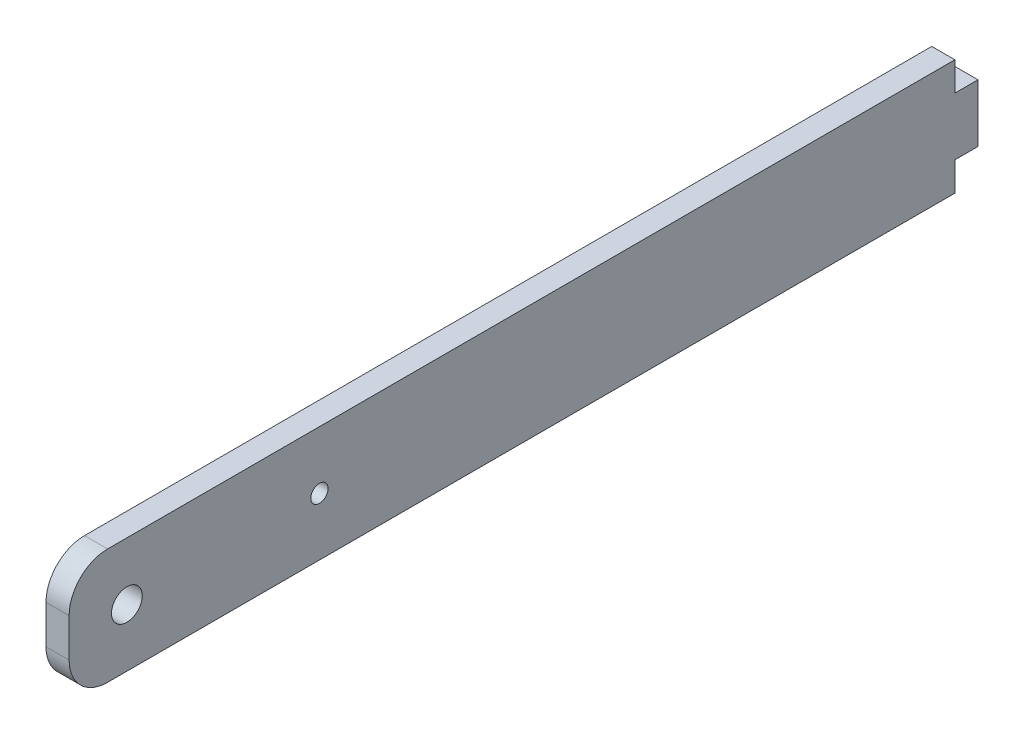
ISO-10303-21;
HEADER;
FILE_DESCRIPTION(('STEP AP214'),'2;1');
FILE_NAME('part.step','',(''),(''),'','','');
FILE_SCHEMA(('AUTOMOTIVE_DESIGN { 1 0 10303 214 1 1 1 1 }'));
ENDSEC;
DATA;
#1=APPLICATION_CONTEXT('core data for automotive mechanical design processes');
#2=APPLICATION_PROTOCOL_DEFINITION('international standard','automotive_design',2000,#1);
#3=PRODUCT_CONTEXT('',#1,'mechanical');
#4=PRODUCT('Part','Part','',(#3));
#5=PRODUCT_RELATED_PRODUCT_CATEGORY('part','',(#4));
#6=PRODUCT_DEFINITION_FORMATION('','',#4);
#7=PRODUCT_DEFINITION_CONTEXT('part definition',#1,'design');
#8=PRODUCT_DEFINITION('design','',#6,#7);
#9=PRODUCT_DEFINITION_SHAPE('','',#8);
#10=(LENGTH_UNIT() NAMED_UNIT(*) SI_UNIT(.MILLI.,.METRE.));
#11=(NAMED_UNIT(*) PLANE_ANGLE_UNIT() SI_UNIT($,.RADIAN.));
#12=(NAMED_UNIT(*) SI_UNIT($,.STERADIAN.) SOLID_ANGLE_UNIT());
#13=UNCERTAINTY_MEASURE_WITH_UNIT(LENGTH_MEASURE(1.E-05),#10,'distance_accuracy_value','');
#14=(GEOMETRIC_REPRESENTATION_CONTEXT(3) GLOBAL_UNCERTAINTY_ASSIGNED_CONTEXT((#13)) GLOBAL_UNIT_ASSIGNED_CONTEXT((#10,
#11,#12)) REPRESENTATION_CONTEXT('',''));
#15=CARTESIAN_POINT('',(0.,0.,0.));
#16=DIRECTION('',(0.,0.,1.));
#17=DIRECTION('',(1.,0.,0.));
#18=AXIS2_PLACEMENT_3D('',#15,#16,#17);
#19=CARTESIAN_POINT('',(3.,0.,0.));
#20=DIRECTION('',(-1.,0.,0.));
#21=DIRECTION('',(0.,0.,1.));
#22=AXIS2_PLACEMENT_3D('',#19,#20,#21);
#23=PLANE('',#22);
#24=DIRECTION('',(0.,-1.,0.));
#25=VECTOR('',#24,1.);
#26=CARTESIAN_POINT('',(3.,15.,115.));
#27=LINE('',#26,#25);
#28=CARTESIAN_POINT('',(3.,5.,115.));
#29=VERTEX_POINT('',#28);
#30=CARTESIAN_POINT('',(3.,-5.,115.));
#31=VERTEX_POINT('',#30);
#32=EDGE_CURVE('E143',#29,#31,#27,.T.);
#33=ORIENTED_EDGE('',*,*,#32,.T.);
#34=CARTESIAN_POINT('',(3.,-5.,105.));
#35=DIRECTION('',(-1.,0.,0.));
#36=DIRECTION('',(0.,0.,1.));
#37=AXIS2_PLACEMENT_3D('',#34,#35,#36);
#38=CIRCLE('',#37,10.);
#39=CARTESIAN_POINT('',(3.,-15.,105.));
#40=VERTEX_POINT('',#39);
#41=EDGE_CURVE('E40',#31,#40,#38,.F.);
#42=ORIENTED_EDGE('',*,*,#41,.T.);
#43=DIRECTION('',(0.,0.,-1.));
#44=VECTOR('',#43,1.);
#45=CARTESIAN_POINT('',(3.,-15.,-115.));
#46=LINE('',#45,#44);
#47=CARTESIAN_POINT('',(3.,-15.,-115.));
#48=VERTEX_POINT('',#47);
#49=EDGE_CURVE('E170',#40,#48,#46,.T.);
#50=ORIENTED_EDGE('',*,*,#49,.T.);
#51=DIRECTION('',(0.,1.,0.));
#52=VECTOR('',#51,1.);
#53=CARTESIAN_POINT('',(3.,15.,-115.));
#54=LINE('',#53,#52);
#55=CARTESIAN_POINT('',(3.,-7.5,-115.));
#56=VERTEX_POINT('',#55);
#57=EDGE_CURVE('E188',#48,#56,#54,.T.);
#58=ORIENTED_EDGE('',*,*,#57,.T.);
#59=DIRECTION('',(0.,0.,-1.));
#60=VECTOR('',#59,1.);
#61=CARTESIAN_POINT('',(3.,-7.5,-115.));
#62=LINE('',#61,#60);
#63=CARTESIAN_POINT('',(3.,-7.5,-121.));
#64=VERTEX_POINT('',#63);
#65=EDGE_CURVE('E116',#56,#64,#62,.T.);
#66=ORIENTED_EDGE('',*,*,#65,.T.);
#67=DIRECTION('',(0.,1.,0.));
#68=VECTOR('',#67,1.);
#69=CARTESIAN_POINT('',(3.,7.5,-121.));
#70=LINE('',#69,#68);
#71=CARTESIAN_POINT('',(3.,7.5,-121.));
#72=VERTEX_POINT('',#71);
#73=EDGE_CURVE('E200',#64,#72,#70,.T.);
#74=ORIENTED_EDGE('',*,*,#73,.T.);
#75=DIRECTION('',(0.,0.,1.));
#76=VECTOR('',#75,1.);
#77=CARTESIAN_POINT('',(3.,7.5,-115.));
#78=LINE('',#77,#76);
#79=CARTESIAN_POINT('',(3.,7.5,-115.));
#80=VERTEX_POINT('',#79);
#81=EDGE_CURVE('E134',#72,#80,#78,.T.);
#82=ORIENTED_EDGE('',*,*,#81,.T.);
#83=CARTESIAN_POINT('',(3.,15.,-115.));
#84=VERTEX_POINT('',#83);
#85=EDGE_CURVE('E175',#80,#84,#54,.T.);
#86=ORIENTED_EDGE('',*,*,#85,.T.);
#87=DIRECTION('',(0.,0.,1.));
#88=VECTOR('',#87,1.);
#89=CARTESIAN_POINT('',(3.,15.,115.));
#90=LINE('',#89,#88);
#91=CARTESIAN_POINT('',(3.,15.,105.));
#92=VERTEX_POINT('',#91);
#93=EDGE_CURVE('E152',#84,#92,#90,.T.);
#94=ORIENTED_EDGE('',*,*,#93,.T.);
#95=CARTESIAN_POINT('',(3.,5.,105.));
#96=DIRECTION('',(-1.,0.,0.));
#97=DIRECTION('',(0.,0.,1.));
#98=AXIS2_PLACEMENT_3D('',#95,#96,#97);
#99=CIRCLE('',#98,10.);
#100=EDGE_CURVE('E165',#92,#29,#99,.F.);
#101=ORIENTED_EDGE('',*,*,#100,.T.);
#102=EDGE_LOOP('',(#33,#42,#50,#58,#66,#74,#82,#86,#94,#101));
#103=FACE_BOUND('',#102,.T.);
#104=CARTESIAN_POINT('',(3.,0.,100.));
#105=DIRECTION('',(1.,0.,0.));
#106=DIRECTION('',(0.,0.,-1.));
#107=AXIS2_PLACEMENT_3D('',#104,#105,#106);
#108=CIRCLE('',#107,3.99999999999999);
#109=CARTESIAN_POINT('',(3.,0.,96.));
#110=VERTEX_POINT('',#109);
#111=EDGE_CURVE('E182',#110,#110,#108,.T.);
#112=ORIENTED_EDGE('',*,*,#111,.F.);
#113=EDGE_LOOP('',(#112));
#114=FACE_BOUND('',#113,.T.);
#115=CARTESIAN_POINT('',(3.,0.,50.));
#116=DIRECTION('',(1.,0.,0.));
#117=DIRECTION('',(0.,0.,-1.));
#118=AXIS2_PLACEMENT_3D('',#115,#116,#117);
#119=CIRCLE('',#118,2.24999999999999);
#120=CARTESIAN_POINT('',(3.,0.,47.75));
#121=VERTEX_POINT('',#120);
#122=EDGE_CURVE('E209',#121,#121,#119,.T.);
#123=ORIENTED_EDGE('',*,*,#122,.F.);
#124=EDGE_LOOP('',(#123));
#125=FACE_BOUND('',#124,.T.);
#126=ADVANCED_FACE('F32',(#103,#114,#125),#23,.F.);
#127=CARTESIAN_POINT('',(3.,15.,-115.));
#128=DIRECTION('',(0.,0.,1.));
#129=DIRECTION('',(1.,0.,0.));
#130=AXIS2_PLACEMENT_3D('',#127,#128,#129);
#131=PLANE('',#130);
#132=DIRECTION('',(1.,0.,0.));
#133=VECTOR('',#132,1.);
#134=CARTESIAN_POINT('',(-3.,7.5,-115.));
#135=LINE('',#134,#133);
#136=CARTESIAN_POINT('',(-3.,7.5,-115.));
#137=VERTEX_POINT('',#136);
#138=EDGE_CURVE('E192',#137,#80,#135,.T.);
#139=ORIENTED_EDGE('',*,*,#138,.F.);
#140=DIRECTION('',(0.,1.,0.));
#141=VECTOR('',#140,1.);
#142=CARTESIAN_POINT('',(-3.,15.,-115.));
#143=LINE('',#142,#141);
#144=CARTESIAN_POINT('',(-3.,15.,-115.));
#145=VERTEX_POINT('',#144);
#146=EDGE_CURVE('E141',#137,#145,#143,.T.);
#147=ORIENTED_EDGE('',*,*,#146,.T.);
#148=DIRECTION('',(-1.,0.,0.));
#149=VECTOR('',#148,1.);
#150=CARTESIAN_POINT('',(3.,15.,-115.));
#151=LINE('',#150,#149);
#152=EDGE_CURVE('E149',#84,#145,#151,.T.);
#153=ORIENTED_EDGE('',*,*,#152,.F.);
#154=ORIENTED_EDGE('',*,*,#85,.F.);
#155=EDGE_LOOP('',(#139,#147,#153,#154));
#156=FACE_BOUND('',#155,.T.);
#157=ADVANCED_FACE('F217',(#156),#131,.F.);
#158=CARTESIAN_POINT('',(-3.,0.,0.));
#159=DIRECTION('',(-1.,0.,0.));
#160=DIRECTION('',(0.,0.,1.));
#161=AXIS2_PLACEMENT_3D('',#158,#159,#160);
#162=PLANE('',#161);
#163=CARTESIAN_POINT('',(-3.,0.,50.));
#164=DIRECTION('',(-1.,0.,0.));
#165=DIRECTION('',(0.,0.,1.));
#166=AXIS2_PLACEMENT_3D('',#163,#164,#165);
#167=CIRCLE('',#166,2.24999999999999);
#168=CARTESIAN_POINT('',(-3.,0.,52.25));
#169=VERTEX_POINT('',#168);
#170=EDGE_CURVE('E204',#169,#169,#167,.T.);
#171=ORIENTED_EDGE('',*,*,#170,.F.);
#172=EDGE_LOOP('',(#171));
#173=FACE_BOUND('',#172,.T.);
#174=DIRECTION('',(0.,0.,-1.));
#175=VECTOR('',#174,1.);
#176=CARTESIAN_POINT('',(-3.,-15.,-115.));
#177=LINE('',#176,#175);
#178=CARTESIAN_POINT('',(-3.,-15.,105.));
#179=VERTEX_POINT('',#178);
#180=CARTESIAN_POINT('',(-3.,-15.,-115.));
#181=VERTEX_POINT('',#180);
#182=EDGE_CURVE('E145',#179,#181,#177,.T.);
#183=ORIENTED_EDGE('',*,*,#182,.F.);
#184=CARTESIAN_POINT('',(-3.,-5.,105.));
#185=DIRECTION('',(-1.,0.,0.));
#186=DIRECTION('',(0.,0.,1.));
#187=AXIS2_PLACEMENT_3D('',#184,#185,#186);
#188=CIRCLE('',#187,10.);
#189=CARTESIAN_POINT('',(-3.,-5.,115.));
#190=VERTEX_POINT('',#189);
#191=EDGE_CURVE('E159',#179,#190,#188,.T.);
#192=ORIENTED_EDGE('',*,*,#191,.T.);
#193=DIRECTION('',(0.,-1.,0.));
#194=VECTOR('',#193,1.);
#195=CARTESIAN_POINT('',(-3.,15.,115.));
#196=LINE('',#195,#194);
#197=CARTESIAN_POINT('',(-3.,5.,115.));
#198=VERTEX_POINT('',#197);
#199=EDGE_CURVE('E179',#198,#190,#196,.T.);
#200=ORIENTED_EDGE('',*,*,#199,.F.);
#201=CARTESIAN_POINT('',(-3.,5.,105.));
#202=DIRECTION('',(-1.,0.,0.));
#203=DIRECTION('',(0.,0.,1.));
#204=AXIS2_PLACEMENT_3D('',#201,#202,#203);
#205=CIRCLE('',#204,10.);
#206=CARTESIAN_POINT('',(-3.,15.,105.));
#207=VERTEX_POINT('',#206);
#208=EDGE_CURVE('E157',#198,#207,#205,.T.);
#209=ORIENTED_EDGE('',*,*,#208,.T.);
#210=DIRECTION('',(0.,0.,1.));
#211=VECTOR('',#210,1.);
#212=CARTESIAN_POINT('',(-3.,15.,115.));
#213=LINE('',#212,#211);
#214=EDGE_CURVE('E140',#145,#207,#213,.T.);
#215=ORIENTED_EDGE('',*,*,#214,.F.);
#216=ORIENTED_EDGE('',*,*,#146,.F.);
#217=DIRECTION('',(0.,0.,1.));
#218=VECTOR('',#217,1.);
#219=CARTESIAN_POINT('',(-3.,7.5,-115.));
#220=LINE('',#219,#218);
#221=CARTESIAN_POINT('',(-3.,7.5,-121.));
#222=VERTEX_POINT('',#221);
#223=EDGE_CURVE('E122',#222,#137,#220,.T.);
#224=ORIENTED_EDGE('',*,*,#223,.F.);
#225=DIRECTION('',(0.,1.,0.));
#226=VECTOR('',#225,1.);
#227=CARTESIAN_POINT('',(-3.,7.5,-121.));
#228=LINE('',#227,#226);
#229=CARTESIAN_POINT('',(-3.,-7.5,-121.));
#230=VERTEX_POINT('',#229);
#231=EDGE_CURVE('E133',#230,#222,#228,.T.);
#232=ORIENTED_EDGE('',*,*,#231,.F.);
#233=DIRECTION('',(0.,0.,-1.));
#234=VECTOR('',#233,1.);
#235=CARTESIAN_POINT('',(-3.,-7.5,-115.));
#236=LINE('',#235,#234);
#237=CARTESIAN_POINT('',(-3.,-7.5,-115.));
#238=VERTEX_POINT('',#237);
#239=EDGE_CURVE('E114',#238,#230,#236,.T.);
#240=ORIENTED_EDGE('',*,*,#239,.F.);
#241=EDGE_CURVE('E130',#181,#238,#143,.T.);
#242=ORIENTED_EDGE('',*,*,#241,.F.);
#243=EDGE_LOOP('',(#183,#192,#200,#209,#215,#216,#224,#232,#240,#242));
#244=FACE_BOUND('',#243,.T.);
#245=CARTESIAN_POINT('',(-3.,0.,100.));
#246=DIRECTION('',(1.,0.,0.));
#247=DIRECTION('',(0.,0.,-1.));
#248=AXIS2_PLACEMENT_3D('',#245,#246,#247);
#249=CIRCLE('',#248,3.99999999999999);
#250=CARTESIAN_POINT('',(-3.,0.,96.));
#251=VERTEX_POINT('',#250);
#252=EDGE_CURVE('E184',#251,#251,#249,.T.);
#253=ORIENTED_EDGE('',*,*,#252,.T.);
#254=EDGE_LOOP('',(#253));
#255=FACE_BOUND('',#254,.T.);
#256=ADVANCED_FACE('F128',(#173,#244,#255),#162,.T.);
#257=CARTESIAN_POINT('',(3.,15.,115.));
#258=DIRECTION('',(0.,0.,-1.));
#259=DIRECTION('',(-1.,0.,0.));
#260=AXIS2_PLACEMENT_3D('',#257,#258,#259);
#261=PLANE('',#260);
#262=ORIENTED_EDGE('',*,*,#199,.T.);
#263=DIRECTION('',(-1.,0.,0.));
#264=VECTOR('',#263,1.);
#265=CARTESIAN_POINT('',(3.,-5.,115.));
#266=LINE('',#265,#264);
#267=EDGE_CURVE('E53',#190,#31,#266,.F.);
#268=ORIENTED_EDGE('',*,*,#267,.T.);
#269=ORIENTED_EDGE('',*,*,#32,.F.);
#270=DIRECTION('',(-1.,0.,0.));
#271=VECTOR('',#270,1.);
#272=CARTESIAN_POINT('',(3.,5.,115.));
#273=LINE('',#272,#271);
#274=EDGE_CURVE('E161',#29,#198,#273,.T.);
#275=ORIENTED_EDGE('',*,*,#274,.T.);
#276=EDGE_LOOP('',(#262,#268,#269,#275));
#277=FACE_BOUND('',#276,.T.);
#278=ADVANCED_FACE('F180',(#277),#261,.F.);
#279=CARTESIAN_POINT('',(3.,-15.,-115.));
#280=DIRECTION('',(0.,1.,0.));
#281=DIRECTION('',(0.,0.,1.));
#282=AXIS2_PLACEMENT_3D('',#279,#280,#281);
#283=PLANE('',#282);
#284=ORIENTED_EDGE('',*,*,#49,.F.);
#285=DIRECTION('',(-1.,0.,0.));
#286=VECTOR('',#285,1.);
#287=CARTESIAN_POINT('',(3.,-15.,105.));
#288=LINE('',#287,#286);
#289=EDGE_CURVE('E154',#40,#179,#288,.T.);
#290=ORIENTED_EDGE('',*,*,#289,.T.);
#291=ORIENTED_EDGE('',*,*,#182,.T.);
#292=DIRECTION('',(-1.,0.,0.));
#293=VECTOR('',#292,1.);
#294=CARTESIAN_POINT('',(3.,-15.,-115.));
#295=LINE('',#294,#293);
#296=EDGE_CURVE('E139',#48,#181,#295,.T.);
#297=ORIENTED_EDGE('',*,*,#296,.F.);
#298=EDGE_LOOP('',(#284,#290,#291,#297));
#299=FACE_BOUND('',#298,.T.);
#300=ADVANCED_FACE('F174',(#299),#283,.F.);
#301=ORIENTED_EDGE('',*,*,#241,.T.);
#302=DIRECTION('',(1.,0.,0.));
#303=VECTOR('',#302,1.);
#304=CARTESIAN_POINT('',(-3.,-7.5,-115.));
#305=LINE('',#304,#303);
#306=EDGE_CURVE('E111',#238,#56,#305,.T.);
#307=ORIENTED_EDGE('',*,*,#306,.T.);
#308=ORIENTED_EDGE('',*,*,#57,.F.);
#309=ORIENTED_EDGE('',*,*,#296,.T.);
#310=EDGE_LOOP('',(#301,#307,#308,#309));
#311=FACE_BOUND('',#310,.T.);
#312=ADVANCED_FACE('F137',(#311),#131,.F.);
#313=CARTESIAN_POINT('',(3.,15.,115.));
#314=DIRECTION('',(0.,-1.,0.));
#315=DIRECTION('',(0.,0.,-1.));
#316=AXIS2_PLACEMENT_3D('',#313,#314,#315);
#317=PLANE('',#316);
#318=ORIENTED_EDGE('',*,*,#214,.T.);
#319=DIRECTION('',(-1.,0.,0.));
#320=VECTOR('',#319,1.);
#321=CARTESIAN_POINT('',(3.,15.,105.));
#322=LINE('',#321,#320);
#323=EDGE_CURVE('E11',#207,#92,#322,.F.);
#324=ORIENTED_EDGE('',*,*,#323,.T.);
#325=ORIENTED_EDGE('',*,*,#93,.F.);
#326=ORIENTED_EDGE('',*,*,#152,.T.);
#327=EDGE_LOOP('',(#318,#324,#325,#326));
#328=FACE_BOUND('',#327,.T.);
#329=ADVANCED_FACE('F231',(#328),#317,.F.);
#330=CARTESIAN_POINT('',(3.,0.,100.));
#331=DIRECTION('',(-1.,0.,0.));
#332=DIRECTION('',(0.,0.,1.));
#333=AXIS2_PLACEMENT_3D('',#330,#331,#332);
#334=CYLINDRICAL_SURFACE('',#333,3.99999999999999);
#335=ORIENTED_EDGE('',*,*,#111,.T.);
#336=EDGE_LOOP('',(#335));
#337=FACE_BOUND('',#336,.T.);
#338=ORIENTED_EDGE('',*,*,#252,.F.);
#339=EDGE_LOOP('',(#338));
#340=FACE_BOUND('',#339,.T.);
#341=ADVANCED_FACE('F226',(#337,#340),#334,.F.);
#342=CARTESIAN_POINT('',(-3.,7.5,-115.));
#343=DIRECTION('',(0.,1.,0.));
#344=DIRECTION('',(0.,0.,1.));
#345=AXIS2_PLACEMENT_3D('',#342,#343,#344);
#346=PLANE('',#345);
#347=ORIENTED_EDGE('',*,*,#81,.F.);
#348=DIRECTION('',(1.,0.,0.));
#349=VECTOR('',#348,1.);
#350=CARTESIAN_POINT('',(-3.,7.5,-121.));
#351=LINE('',#350,#349);
#352=EDGE_CURVE('E195',#222,#72,#351,.T.);
#353=ORIENTED_EDGE('',*,*,#352,.F.);
#354=ORIENTED_EDGE('',*,*,#223,.T.);
#355=ORIENTED_EDGE('',*,*,#138,.T.);
#356=EDGE_LOOP('',(#347,#353,#354,#355));
#357=FACE_BOUND('',#356,.T.);
#358=ADVANCED_FACE('F250',(#357),#346,.T.);
#359=CARTESIAN_POINT('',(-3.,7.5,-121.));
#360=DIRECTION('',(0.,0.,-1.));
#361=DIRECTION('',(-1.,0.,0.));
#362=AXIS2_PLACEMENT_3D('',#359,#360,#361);
#363=PLANE('',#362);
#364=ORIENTED_EDGE('',*,*,#73,.F.);
#365=DIRECTION('',(1.,0.,0.));
#366=VECTOR('',#365,1.);
#367=CARTESIAN_POINT('',(-3.,-7.5,-121.));
#368=LINE('',#367,#366);
#369=EDGE_CURVE('E121',#230,#64,#368,.T.);
#370=ORIENTED_EDGE('',*,*,#369,.F.);
#371=ORIENTED_EDGE('',*,*,#231,.T.);
#372=ORIENTED_EDGE('',*,*,#352,.T.);
#373=EDGE_LOOP('',(#364,#370,#371,#372));
#374=FACE_BOUND('',#373,.T.);
#375=ADVANCED_FACE('F248',(#374),#363,.T.);
#376=CARTESIAN_POINT('',(-3.,-7.5,-115.));
#377=DIRECTION('',(0.,-1.,0.));
#378=DIRECTION('',(0.,0.,-1.));
#379=AXIS2_PLACEMENT_3D('',#376,#377,#378);
#380=PLANE('',#379);
#381=ORIENTED_EDGE('',*,*,#65,.F.);
#382=ORIENTED_EDGE('',*,*,#306,.F.);
#383=ORIENTED_EDGE('',*,*,#239,.T.);
#384=ORIENTED_EDGE('',*,*,#369,.T.);
#385=EDGE_LOOP('',(#381,#382,#383,#384));
#386=FACE_BOUND('',#385,.T.);
#387=ADVANCED_FACE('F113',(#386),#380,.T.);
#388=CARTESIAN_POINT('',(3.,0.,50.));
#389=DIRECTION('',(1.,0.,0.));
#390=DIRECTION('',(0.,0.,-1.));
#391=AXIS2_PLACEMENT_3D('',#388,#389,#390);
#392=CYLINDRICAL_SURFACE('',#391,2.24999999999999);
#393=ORIENTED_EDGE('',*,*,#122,.T.);
#394=EDGE_LOOP('',(#393));
#395=FACE_BOUND('',#394,.T.);
#396=ORIENTED_EDGE('',*,*,#170,.T.);
#397=EDGE_LOOP('',(#396));
#398=FACE_BOUND('',#397,.T.);
#399=ADVANCED_FACE('F213',(#395,#398),#392,.F.);
#400=CARTESIAN_POINT('',(3.,-5.,105.));
#401=DIRECTION('',(-1.,0.,0.));
#402=DIRECTION('',(0.,0.,1.));
#403=AXIS2_PLACEMENT_3D('',#400,#401,#402);
#404=CYLINDRICAL_SURFACE('',#403,10.);
#405=ORIENTED_EDGE('',*,*,#41,.F.);
#406=ORIENTED_EDGE('',*,*,#267,.F.);
#407=ORIENTED_EDGE('',*,*,#191,.F.);
#408=ORIENTED_EDGE('',*,*,#289,.F.);
#409=EDGE_LOOP('',(#405,#406,#407,#408));
#410=FACE_BOUND('',#409,.T.);
#411=ADVANCED_FACE('F177',(#410),#404,.T.);
#412=CARTESIAN_POINT('',(3.,5.,105.));
#413=DIRECTION('',(-1.,0.,0.));
#414=DIRECTION('',(0.,0.,1.));
#415=AXIS2_PLACEMENT_3D('',#412,#413,#414);
#416=CYLINDRICAL_SURFACE('',#415,10.);
#417=ORIENTED_EDGE('',*,*,#100,.F.);
#418=ORIENTED_EDGE('',*,*,#323,.F.);
#419=ORIENTED_EDGE('',*,*,#208,.F.);
#420=ORIENTED_EDGE('',*,*,#274,.F.);
#421=EDGE_LOOP('',(#417,#418,#419,#420));
#422=FACE_BOUND('',#421,.T.);
#423=ADVANCED_FACE('F34',(#422),#416,.T.);
#424=CLOSED_SHELL('',(#126,#157,#256,#278,#300,#312,#329,#341,#358,#375,#387,#399,#411,#423));
#425=MANIFOLD_SOLID_BREP('B2',#424);
#426=ADVANCED_BREP_SHAPE_REPRESENTATION('',(#18,#425),#14);
#427=SHAPE_DEFINITION_REPRESENTATION(#9,#426);
ENDSEC;
END-ISO-10303-21;
